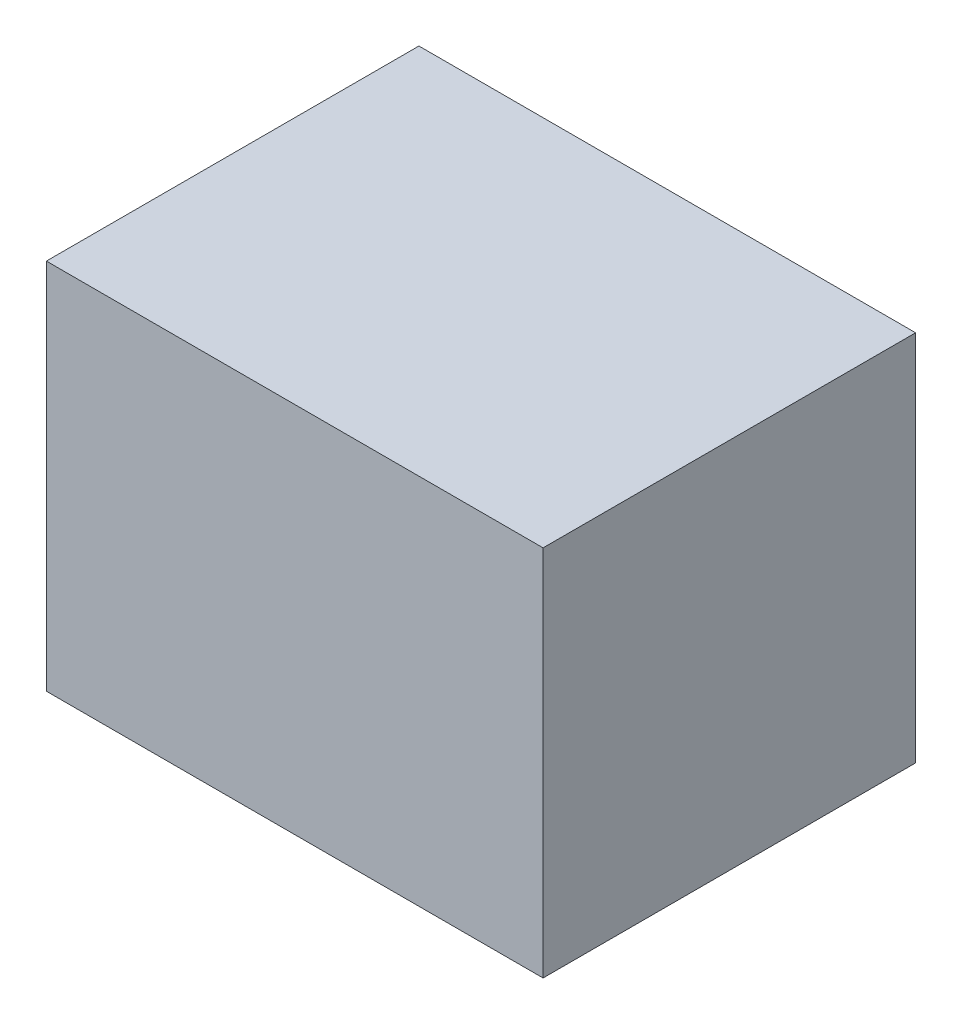
ISO-10303-21;
HEADER;
FILE_DESCRIPTION(('STEP AP214'),'2;1');
FILE_NAME('part.step','',(''),(''),'','','');
FILE_SCHEMA(('AUTOMOTIVE_DESIGN { 1 0 10303 214 1 1 1 1 }'));
ENDSEC;
DATA;
#1=APPLICATION_CONTEXT('core data for automotive mechanical design processes');
#2=APPLICATION_PROTOCOL_DEFINITION('international standard','automotive_design',2000,#1);
#3=PRODUCT_CONTEXT('',#1,'mechanical');
#4=PRODUCT('Part','Part','',(#3));
#5=PRODUCT_RELATED_PRODUCT_CATEGORY('part','',(#4));
#6=PRODUCT_DEFINITION_FORMATION('','',#4);
#7=PRODUCT_DEFINITION_CONTEXT('part definition',#1,'design');
#8=PRODUCT_DEFINITION('design','',#6,#7);
#9=PRODUCT_DEFINITION_SHAPE('','',#8);
#10=(LENGTH_UNIT() NAMED_UNIT(*) SI_UNIT(.MILLI.,.METRE.));
#11=(NAMED_UNIT(*) PLANE_ANGLE_UNIT() SI_UNIT($,.RADIAN.));
#12=(NAMED_UNIT(*) SI_UNIT($,.STERADIAN.) SOLID_ANGLE_UNIT());
#13=UNCERTAINTY_MEASURE_WITH_UNIT(LENGTH_MEASURE(1.E-05),#10,'distance_accuracy_value','');
#14=(GEOMETRIC_REPRESENTATION_CONTEXT(3) GLOBAL_UNCERTAINTY_ASSIGNED_CONTEXT((#13)) GLOBAL_UNIT_ASSIGNED_CONTEXT((#10,
#11,#12)) REPRESENTATION_CONTEXT('',''));
#15=CARTESIAN_POINT('',(0.,0.,0.));
#16=DIRECTION('',(0.,0.,1.));
#17=DIRECTION('',(1.,0.,0.));
#18=AXIS2_PLACEMENT_3D('',#15,#16,#17);
#19=CARTESIAN_POINT('',(-95.6311239193084,120.,-74.5648414985591));
#20=DIRECTION('',(1.,0.,0.));
#21=DIRECTION('',(0.,0.,-1.));
#22=AXIS2_PLACEMENT_3D('',#19,#20,#21);
#23=PLANE('',#22);
#24=DIRECTION('',(0.,0.,1.));
#25=VECTOR('',#24,1.);
#26=CARTESIAN_POINT('',(-95.6311239193084,0.,-74.5648414985591));
#27=LINE('',#26,#25);
#28=CARTESIAN_POINT('',(-95.6311239193084,0.,-74.5648414985591));
#29=VERTEX_POINT('',#28);
#30=CARTESIAN_POINT('',(-95.6311239193084,0.,45.4351585014409));
#31=VERTEX_POINT('',#30);
#32=EDGE_CURVE('E98',#29,#31,#27,.T.);
#33=ORIENTED_EDGE('',*,*,#32,.T.);
#34=DIRECTION('',(0.,-1.,0.));
#35=VECTOR('',#34,1.);
#36=CARTESIAN_POINT('',(-95.6311239193084,120.,45.4351585014409));
#37=LINE('',#36,#35);
#38=CARTESIAN_POINT('',(-95.6311239193084,120.,45.4351585014409));
#39=VERTEX_POINT('',#38);
#40=EDGE_CURVE('E11',#39,#31,#37,.T.);
#41=ORIENTED_EDGE('',*,*,#40,.F.);
#42=DIRECTION('',(0.,0.,1.));
#43=VECTOR('',#42,1.);
#44=CARTESIAN_POINT('',(-95.6311239193084,120.,-74.5648414985591));
#45=LINE('',#44,#43);
#46=CARTESIAN_POINT('',(-95.6311239193084,120.,-74.5648414985591));
#47=VERTEX_POINT('',#46);
#48=EDGE_CURVE('E86',#47,#39,#45,.T.);
#49=ORIENTED_EDGE('',*,*,#48,.F.);
#50=DIRECTION('',(0.,-1.,0.));
#51=VECTOR('',#50,1.);
#52=CARTESIAN_POINT('',(-95.6311239193084,120.,-74.5648414985591));
#53=LINE('',#52,#51);
#54=EDGE_CURVE('E94',#47,#29,#53,.T.);
#55=ORIENTED_EDGE('',*,*,#54,.T.);
#56=EDGE_LOOP('',(#33,#41,#49,#55));
#57=FACE_BOUND('',#56,.T.);
#58=ADVANCED_FACE('F35',(#57),#23,.F.);
#59=CARTESIAN_POINT('',(-95.6311239193084,120.,45.4351585014409));
#60=DIRECTION('',(0.,0.,-1.));
#61=DIRECTION('',(-1.,0.,0.));
#62=AXIS2_PLACEMENT_3D('',#59,#60,#61);
#63=PLANE('',#62);
#64=DIRECTION('',(1.,0.,0.));
#65=VECTOR('',#64,1.);
#66=CARTESIAN_POINT('',(-95.6311239193084,0.,45.4351585014409));
#67=LINE('',#66,#65);
#68=CARTESIAN_POINT('',(64.3688760806917,0.,45.4351585014409));
#69=VERTEX_POINT('',#68);
#70=EDGE_CURVE('E90',#31,#69,#67,.T.);
#71=ORIENTED_EDGE('',*,*,#70,.T.);
#72=DIRECTION('',(0.,-1.,0.));
#73=VECTOR('',#72,1.);
#74=CARTESIAN_POINT('',(64.3688760806917,120.,45.4351585014409));
#75=LINE('',#74,#73);
#76=CARTESIAN_POINT('',(64.3688760806917,120.,45.4351585014409));
#77=VERTEX_POINT('',#76);
#78=EDGE_CURVE('E43',#77,#69,#75,.T.);
#79=ORIENTED_EDGE('',*,*,#78,.F.);
#80=DIRECTION('',(1.,0.,0.));
#81=VECTOR('',#80,1.);
#82=CARTESIAN_POINT('',(-95.6311239193084,120.,45.4351585014409));
#83=LINE('',#82,#81);
#84=EDGE_CURVE('E81',#39,#77,#83,.T.);
#85=ORIENTED_EDGE('',*,*,#84,.F.);
#86=ORIENTED_EDGE('',*,*,#40,.T.);
#87=EDGE_LOOP('',(#71,#79,#85,#86));
#88=FACE_BOUND('',#87,.T.);
#89=ADVANCED_FACE('F89',(#88),#63,.F.);
#90=CARTESIAN_POINT('',(64.3688760806916,120.,-74.5648414985591));
#91=DIRECTION('',(-1.,0.,0.));
#92=DIRECTION('',(0.,0.,1.));
#93=AXIS2_PLACEMENT_3D('',#90,#91,#92);
#94=PLANE('',#93);
#95=DIRECTION('',(0.,0.,-1.));
#96=VECTOR('',#95,1.);
#97=CARTESIAN_POINT('',(64.3688760806916,0.,-74.5648414985591));
#98=LINE('',#97,#96);
#99=CARTESIAN_POINT('',(64.3688760806916,0.,-74.5648414985591));
#100=VERTEX_POINT('',#99);
#101=EDGE_CURVE('E68',#69,#100,#98,.T.);
#102=ORIENTED_EDGE('',*,*,#101,.T.);
#103=DIRECTION('',(0.,-1.,0.));
#104=VECTOR('',#103,1.);
#105=CARTESIAN_POINT('',(64.3688760806916,120.,-74.5648414985591));
#106=LINE('',#105,#104);
#107=CARTESIAN_POINT('',(64.3688760806916,120.,-74.5648414985591));
#108=VERTEX_POINT('',#107);
#109=EDGE_CURVE('E91',#108,#100,#106,.T.);
#110=ORIENTED_EDGE('',*,*,#109,.F.);
#111=DIRECTION('',(0.,0.,-1.));
#112=VECTOR('',#111,1.);
#113=CARTESIAN_POINT('',(64.3688760806916,120.,-74.5648414985591));
#114=LINE('',#113,#112);
#115=EDGE_CURVE('E84',#77,#108,#114,.T.);
#116=ORIENTED_EDGE('',*,*,#115,.F.);
#117=ORIENTED_EDGE('',*,*,#78,.T.);
#118=EDGE_LOOP('',(#102,#110,#116,#117));
#119=FACE_BOUND('',#118,.T.);
#120=ADVANCED_FACE('F92',(#119),#94,.F.);
#121=CARTESIAN_POINT('',(-95.6311239193084,120.,-74.5648414985591));
#122=DIRECTION('',(0.,0.,1.));
#123=DIRECTION('',(1.,0.,0.));
#124=AXIS2_PLACEMENT_3D('',#121,#122,#123);
#125=PLANE('',#124);
#126=DIRECTION('',(-1.,0.,0.));
#127=VECTOR('',#126,1.);
#128=CARTESIAN_POINT('',(-95.6311239193084,0.,-74.5648414985591));
#129=LINE('',#128,#127);
#130=EDGE_CURVE('E74',#100,#29,#129,.T.);
#131=ORIENTED_EDGE('',*,*,#130,.T.);
#132=ORIENTED_EDGE('',*,*,#54,.F.);
#133=DIRECTION('',(-1.,0.,0.));
#134=VECTOR('',#133,1.);
#135=CARTESIAN_POINT('',(-95.6311239193084,120.,-74.5648414985591));
#136=LINE('',#135,#134);
#137=EDGE_CURVE('E51',#108,#47,#136,.T.);
#138=ORIENTED_EDGE('',*,*,#137,.F.);
#139=ORIENTED_EDGE('',*,*,#109,.T.);
#140=EDGE_LOOP('',(#131,#132,#138,#139));
#141=FACE_BOUND('',#140,.T.);
#142=ADVANCED_FACE('F105',(#141),#125,.F.);
#143=CARTESIAN_POINT('',(0.,120.,0.));
#144=DIRECTION('',(0.,1.,0.));
#145=DIRECTION('',(0.,0.,1.));
#146=AXIS2_PLACEMENT_3D('',#143,#144,#145);
#147=PLANE('',#146);
#148=ORIENTED_EDGE('',*,*,#48,.T.);
#149=ORIENTED_EDGE('',*,*,#84,.T.);
#150=ORIENTED_EDGE('',*,*,#115,.T.);
#151=ORIENTED_EDGE('',*,*,#137,.T.);
#152=EDGE_LOOP('',(#148,#149,#150,#151));
#153=FACE_BOUND('',#152,.T.);
#154=ADVANCED_FACE('F82',(#153),#147,.T.);
#155=CARTESIAN_POINT('',(0.,0.,0.));
#156=DIRECTION('',(0.,1.,0.));
#157=DIRECTION('',(0.,0.,1.));
#158=AXIS2_PLACEMENT_3D('',#155,#156,#157);
#159=PLANE('',#158);
#160=ORIENTED_EDGE('',*,*,#32,.F.);
#161=ORIENTED_EDGE('',*,*,#130,.F.);
#162=ORIENTED_EDGE('',*,*,#101,.F.);
#163=ORIENTED_EDGE('',*,*,#70,.F.);
#164=EDGE_LOOP('',(#160,#161,#162,#163));
#165=FACE_BOUND('',#164,.T.);
#166=ADVANCED_FACE('F108',(#165),#159,.F.);
#167=CLOSED_SHELL('',(#58,#89,#120,#142,#154,#166));
#168=MANIFOLD_SOLID_BREP('B2',#167);
#169=ADVANCED_BREP_SHAPE_REPRESENTATION('',(#18,#168),#14);
#170=SHAPE_DEFINITION_REPRESENTATION(#9,#169);
ENDSEC;
END-ISO-10303-21;
